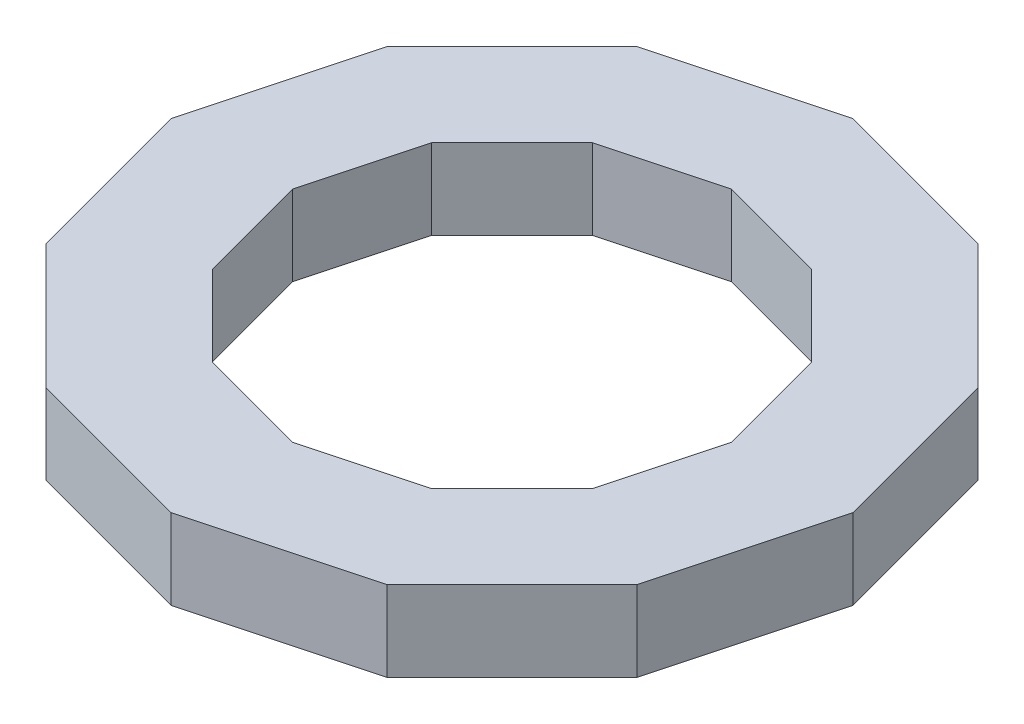
ISO-10303-21;
HEADER;
FILE_DESCRIPTION(('STEP AP214'),'2;1');
FILE_NAME('part.step','',(''),(''),'','','');
FILE_SCHEMA(('AUTOMOTIVE_DESIGN { 1 0 10303 214 1 1 1 1 }'));
ENDSEC;
DATA;
#1=APPLICATION_CONTEXT('core data for automotive mechanical design processes');
#2=APPLICATION_PROTOCOL_DEFINITION('international standard','automotive_design',2000,#1);
#3=PRODUCT_CONTEXT('',#1,'mechanical');
#4=PRODUCT('Part','Part','',(#3));
#5=PRODUCT_RELATED_PRODUCT_CATEGORY('part','',(#4));
#6=PRODUCT_DEFINITION_FORMATION('','',#4);
#7=PRODUCT_DEFINITION_CONTEXT('part definition',#1,'design');
#8=PRODUCT_DEFINITION('design','',#6,#7);
#9=PRODUCT_DEFINITION_SHAPE('','',#8);
#10=(LENGTH_UNIT() NAMED_UNIT(*) SI_UNIT(.MILLI.,.METRE.));
#11=(NAMED_UNIT(*) PLANE_ANGLE_UNIT() SI_UNIT($,.RADIAN.));
#12=(NAMED_UNIT(*) SI_UNIT($,.STERADIAN.) SOLID_ANGLE_UNIT());
#13=UNCERTAINTY_MEASURE_WITH_UNIT(LENGTH_MEASURE(1.E-05),#10,'distance_accuracy_value','');
#14=(GEOMETRIC_REPRESENTATION_CONTEXT(3) GLOBAL_UNCERTAINTY_ASSIGNED_CONTEXT((#13)) GLOBAL_UNIT_ASSIGNED_CONTEXT((#10,
#11,#12)) REPRESENTATION_CONTEXT('',''));
#15=CARTESIAN_POINT('',(0.,0.,0.));
#16=DIRECTION('',(0.,0.,1.));
#17=DIRECTION('',(1.,0.,0.));
#18=AXIS2_PLACEMENT_3D('',#15,#16,#17);
#19=CARTESIAN_POINT('',(0.,19.05,0.));
#20=DIRECTION('',(0.,1.,0.));
#21=DIRECTION('',(0.,0.,1.));
#22=AXIS2_PLACEMENT_3D('',#19,#20,#21);
#23=PLANE('',#22);
#24=DIRECTION('',(0.258819045102521,0.,-0.965925826289068));
#25=VECTOR('',#24,1.);
#26=CARTESIAN_POINT('',(70.1167965793031,19.05,40.4819513797749));
#27=LINE('',#26,#25);
#28=CARTESIAN_POINT('',(70.1167965793031,19.05,40.4819513797749));
#29=VERTEX_POINT('',#28);
#30=CARTESIAN_POINT('',(80.9639027595498,19.05,0.));
#31=VERTEX_POINT('',#30);
#32=EDGE_CURVE('E297',#29,#31,#27,.T.);
#33=ORIENTED_EDGE('',*,*,#32,.T.);
#34=DIRECTION('',(-0.258819045102521,0.,-0.965925826289068));
#35=VECTOR('',#34,1.);
#36=CARTESIAN_POINT('',(80.9639027595498,19.05,0.));
#37=LINE('',#36,#35);
#38=CARTESIAN_POINT('',(70.1167965793031,19.05,-40.4819513797749));
#39=VERTEX_POINT('',#38);
#40=EDGE_CURVE('E301',#31,#39,#37,.T.);
#41=ORIENTED_EDGE('',*,*,#40,.T.);
#42=DIRECTION('',(-0.707106781186548,0.,-0.707106781186547));
#43=VECTOR('',#42,1.);
#44=CARTESIAN_POINT('',(70.1167965793031,19.05,-40.4819513797749));
#45=LINE('',#44,#43);
#46=CARTESIAN_POINT('',(40.4819513797749,19.05,-70.1167965793031));
#47=VERTEX_POINT('',#46);
#48=EDGE_CURVE('E305',#39,#47,#45,.T.);
#49=ORIENTED_EDGE('',*,*,#48,.T.);
#50=DIRECTION('',(-0.965925826289068,0.,-0.258819045102521));
#51=VECTOR('',#50,1.);
#52=CARTESIAN_POINT('',(40.4819513797749,19.05,-70.1167965793031));
#53=LINE('',#52,#51);
#54=CARTESIAN_POINT('',(0.,19.05,-80.9639027595497));
#55=VERTEX_POINT('',#54);
#56=EDGE_CURVE('E307',#47,#55,#53,.T.);
#57=ORIENTED_EDGE('',*,*,#56,.T.);
#58=DIRECTION('',(-0.965925826289068,0.,0.258819045102521));
#59=VECTOR('',#58,1.);
#60=CARTESIAN_POINT('',(0.,19.05,-80.9639027595497));
#61=LINE('',#60,#59);
#62=CARTESIAN_POINT('',(-40.4819513797748,19.05,-70.1167965793031));
#63=VERTEX_POINT('',#62);
#64=EDGE_CURVE('E309',#55,#63,#61,.T.);
#65=ORIENTED_EDGE('',*,*,#64,.T.);
#66=DIRECTION('',(-0.707106781186547,0.,0.707106781186547));
#67=VECTOR('',#66,1.);
#68=CARTESIAN_POINT('',(-40.4819513797748,19.05,-70.1167965793031));
#69=LINE('',#68,#67);
#70=CARTESIAN_POINT('',(-70.1167965793031,19.05,-40.4819513797749));
#71=VERTEX_POINT('',#70);
#72=EDGE_CURVE('E311',#63,#71,#69,.T.);
#73=ORIENTED_EDGE('',*,*,#72,.T.);
#74=DIRECTION('',(-0.258819045102521,0.,0.965925826289068));
#75=VECTOR('',#74,1.);
#76=CARTESIAN_POINT('',(-70.1167965793031,19.05,-40.4819513797749));
#77=LINE('',#76,#75);
#78=CARTESIAN_POINT('',(-80.9639027595497,19.05,0.));
#79=VERTEX_POINT('',#78);
#80=EDGE_CURVE('E313',#71,#79,#77,.T.);
#81=ORIENTED_EDGE('',*,*,#80,.T.);
#82=DIRECTION('',(0.258819045102521,0.,0.965925826289068));
#83=VECTOR('',#82,1.);
#84=CARTESIAN_POINT('',(-80.9639027595497,19.05,0.));
#85=LINE('',#84,#83);
#86=CARTESIAN_POINT('',(-70.1167965793031,19.05,40.4819513797749));
#87=VERTEX_POINT('',#86);
#88=EDGE_CURVE('E316',#79,#87,#85,.T.);
#89=ORIENTED_EDGE('',*,*,#88,.T.);
#90=DIRECTION('',(0.707106781186548,0.,0.707106781186547));
#91=VECTOR('',#90,1.);
#92=CARTESIAN_POINT('',(-70.1167965793031,19.05,40.4819513797749));
#93=LINE('',#92,#91);
#94=CARTESIAN_POINT('',(-40.4819513797749,19.05,70.1167965793031));
#95=VERTEX_POINT('',#94);
#96=EDGE_CURVE('E318',#87,#95,#93,.T.);
#97=ORIENTED_EDGE('',*,*,#96,.T.);
#98=DIRECTION('',(0.965925826289068,0.,0.258819045102521));
#99=VECTOR('',#98,1.);
#100=CARTESIAN_POINT('',(-40.4819513797749,19.05,70.1167965793031));
#101=LINE('',#100,#99);
#102=CARTESIAN_POINT('',(0.,19.05,80.9639027595498));
#103=VERTEX_POINT('',#102);
#104=EDGE_CURVE('E320',#95,#103,#101,.T.);
#105=ORIENTED_EDGE('',*,*,#104,.T.);
#106=DIRECTION('',(0.965925826289068,0.,-0.258819045102521));
#107=VECTOR('',#106,1.);
#108=CARTESIAN_POINT('',(0.,19.05,80.9639027595498));
#109=LINE('',#108,#107);
#110=CARTESIAN_POINT('',(40.4819513797748,19.05,70.1167965793031));
#111=VERTEX_POINT('',#110);
#112=EDGE_CURVE('E322',#103,#111,#109,.T.);
#113=ORIENTED_EDGE('',*,*,#112,.T.);
#114=DIRECTION('',(0.707106781186548,0.,-0.707106781186548));
#115=VECTOR('',#114,1.);
#116=CARTESIAN_POINT('',(40.4819513797748,19.05,70.1167965793031));
#117=LINE('',#116,#115);
#118=EDGE_CURVE('E324',#111,#29,#117,.T.);
#119=ORIENTED_EDGE('',*,*,#118,.T.);
#120=EDGE_LOOP('',(#33,#41,#49,#57,#65,#73,#81,#89,#97,#105,#113,#119));
#121=FACE_BOUND('',#120,.T.);
#122=DIRECTION('',(-0.258819045102521,0.,-0.965925826289068));
#123=VECTOR('',#122,1.);
#124=CARTESIAN_POINT('',(52.038286278892,19.05,0.));
#125=LINE('',#124,#123);
#126=CARTESIAN_POINT('',(52.038286278892,19.05,0.));
#127=VERTEX_POINT('',#126);
#128=CARTESIAN_POINT('',(45.0664778869277,19.05,-26.019143139446));
#129=VERTEX_POINT('',#128);
#130=EDGE_CURVE('E205',#127,#129,#125,.T.);
#131=ORIENTED_EDGE('',*,*,#130,.F.);
#132=DIRECTION('',(0.25881904510252,0.,-0.965925826289068));
#133=VECTOR('',#132,1.);
#134=CARTESIAN_POINT('',(45.0664778869277,19.05,26.019143139446));
#135=LINE('',#134,#133);
#136=CARTESIAN_POINT('',(45.0664778869277,19.05,26.019143139446));
#137=VERTEX_POINT('',#136);
#138=EDGE_CURVE('E196',#137,#127,#135,.T.);
#139=ORIENTED_EDGE('',*,*,#138,.F.);
#140=DIRECTION('',(0.707106781186547,0.,-0.707106781186548));
#141=VECTOR('',#140,1.);
#142=CARTESIAN_POINT('',(26.019143139446,19.05,45.0664778869277));
#143=LINE('',#142,#141);
#144=CARTESIAN_POINT('',(26.019143139446,19.05,45.0664778869277));
#145=VERTEX_POINT('',#144);
#146=EDGE_CURVE('E240',#145,#137,#143,.T.);
#147=ORIENTED_EDGE('',*,*,#146,.F.);
#148=DIRECTION('',(0.965925826289068,0.,-0.258819045102521));
#149=VECTOR('',#148,1.);
#150=CARTESIAN_POINT('',(0.,19.05,52.038286278892));
#151=LINE('',#150,#149);
#152=CARTESIAN_POINT('',(0.,19.05,52.038286278892));
#153=VERTEX_POINT('',#152);
#154=EDGE_CURVE('E237',#153,#145,#151,.T.);
#155=ORIENTED_EDGE('',*,*,#154,.F.);
#156=DIRECTION('',(0.965925826289068,0.,0.258819045102521));
#157=VECTOR('',#156,1.);
#158=CARTESIAN_POINT('',(-26.019143139446,19.05,45.0664778869277));
#159=LINE('',#158,#157);
#160=CARTESIAN_POINT('',(-26.019143139446,19.05,45.0664778869277));
#161=VERTEX_POINT('',#160);
#162=EDGE_CURVE('E235',#161,#153,#159,.T.);
#163=ORIENTED_EDGE('',*,*,#162,.F.);
#164=DIRECTION('',(0.707106781186548,0.,0.707106781186547));
#165=VECTOR('',#164,1.);
#166=CARTESIAN_POINT('',(-45.0664778869277,19.05,26.019143139446));
#167=LINE('',#166,#165);
#168=CARTESIAN_POINT('',(-45.0664778869277,19.05,26.019143139446));
#169=VERTEX_POINT('',#168);
#170=EDGE_CURVE('E232',#169,#161,#167,.T.);
#171=ORIENTED_EDGE('',*,*,#170,.F.);
#172=DIRECTION('',(0.258819045102521,0.,0.965925826289068));
#173=VECTOR('',#172,1.);
#174=CARTESIAN_POINT('',(-52.0382862788921,19.05,0.));
#175=LINE('',#174,#173);
#176=CARTESIAN_POINT('',(-52.0382862788921,19.05,0.));
#177=VERTEX_POINT('',#176);
#178=EDGE_CURVE('E230',#177,#169,#175,.T.);
#179=ORIENTED_EDGE('',*,*,#178,.F.);
#180=DIRECTION('',(-0.258819045102521,0.,0.965925826289068));
#181=VECTOR('',#180,1.);
#182=CARTESIAN_POINT('',(-45.0664778869277,19.05,-26.019143139446));
#183=LINE('',#182,#181);
#184=CARTESIAN_POINT('',(-45.0664778869277,19.05,-26.019143139446));
#185=VERTEX_POINT('',#184);
#186=EDGE_CURVE('E228',#185,#177,#183,.T.);
#187=ORIENTED_EDGE('',*,*,#186,.F.);
#188=DIRECTION('',(-0.707106781186547,0.,0.707106781186548));
#189=VECTOR('',#188,1.);
#190=CARTESIAN_POINT('',(-26.019143139446,19.05,-45.0664778869277));
#191=LINE('',#190,#189);
#192=CARTESIAN_POINT('',(-26.019143139446,19.05,-45.0664778869277));
#193=VERTEX_POINT('',#192);
#194=EDGE_CURVE('E226',#193,#185,#191,.T.);
#195=ORIENTED_EDGE('',*,*,#194,.F.);
#196=DIRECTION('',(-0.965925826289068,0.,0.258819045102521));
#197=VECTOR('',#196,1.);
#198=CARTESIAN_POINT('',(0.,19.05,-52.038286278892));
#199=LINE('',#198,#197);
#200=CARTESIAN_POINT('',(0.,19.05,-52.038286278892));
#201=VERTEX_POINT('',#200);
#202=EDGE_CURVE('E224',#201,#193,#199,.T.);
#203=ORIENTED_EDGE('',*,*,#202,.F.);
#204=DIRECTION('',(-0.965925826289068,0.,-0.25881904510252));
#205=VECTOR('',#204,1.);
#206=CARTESIAN_POINT('',(26.0191431394459,19.05,-45.0664778869277));
#207=LINE('',#206,#205);
#208=CARTESIAN_POINT('',(26.0191431394459,19.05,-45.0664778869277));
#209=VERTEX_POINT('',#208);
#210=EDGE_CURVE('E220',#209,#201,#207,.T.);
#211=ORIENTED_EDGE('',*,*,#210,.F.);
#212=DIRECTION('',(-0.707106781186548,0.,-0.707106781186547));
#213=VECTOR('',#212,1.);
#214=CARTESIAN_POINT('',(45.0664778869277,19.05,-26.019143139446));
#215=LINE('',#214,#213);
#216=EDGE_CURVE('E218',#129,#209,#215,.T.);
#217=ORIENTED_EDGE('',*,*,#216,.F.);
#218=EDGE_LOOP('',(#131,#139,#147,#155,#163,#171,#179,#187,#195,#203,#211,#217));
#219=FACE_BOUND('',#218,.T.);
#220=ADVANCED_FACE('F35',(#121,#219),#23,.T.);
#221=CARTESIAN_POINT('',(0.,0.,0.));
#222=DIRECTION('',(0.,1.,0.));
#223=DIRECTION('',(0.,0.,1.));
#224=AXIS2_PLACEMENT_3D('',#221,#222,#223);
#225=PLANE('',#224);
#226=DIRECTION('',(0.258819045102521,0.,-0.965925826289068));
#227=VECTOR('',#226,1.);
#228=CARTESIAN_POINT('',(70.1167965793031,0.,40.4819513797749));
#229=LINE('',#228,#227);
#230=CARTESIAN_POINT('',(70.1167965793031,0.,40.4819513797749));
#231=VERTEX_POINT('',#230);
#232=CARTESIAN_POINT('',(80.9639027595498,0.,0.));
#233=VERTEX_POINT('',#232);
#234=EDGE_CURVE('E213',#231,#233,#229,.T.);
#235=ORIENTED_EDGE('',*,*,#234,.F.);
#236=DIRECTION('',(0.707106781186548,0.,-0.707106781186548));
#237=VECTOR('',#236,1.);
#238=CARTESIAN_POINT('',(40.4819513797748,0.,70.1167965793031));
#239=LINE('',#238,#237);
#240=CARTESIAN_POINT('',(40.4819513797748,0.,70.1167965793031));
#241=VERTEX_POINT('',#240);
#242=EDGE_CURVE('E302',#241,#231,#239,.T.);
#243=ORIENTED_EDGE('',*,*,#242,.F.);
#244=DIRECTION('',(0.965925826289068,0.,-0.258819045102521));
#245=VECTOR('',#244,1.);
#246=CARTESIAN_POINT('',(0.,0.,80.9639027595498));
#247=LINE('',#246,#245);
#248=CARTESIAN_POINT('',(0.,0.,80.9639027595498));
#249=VERTEX_POINT('',#248);
#250=EDGE_CURVE('E348',#249,#241,#247,.T.);
#251=ORIENTED_EDGE('',*,*,#250,.F.);
#252=DIRECTION('',(0.965925826289068,0.,0.258819045102521));
#253=VECTOR('',#252,1.);
#254=CARTESIAN_POINT('',(-40.4819513797749,0.,70.1167965793031));
#255=LINE('',#254,#253);
#256=CARTESIAN_POINT('',(-40.4819513797749,0.,70.1167965793031));
#257=VERTEX_POINT('',#256);
#258=EDGE_CURVE('E346',#257,#249,#255,.T.);
#259=ORIENTED_EDGE('',*,*,#258,.F.);
#260=DIRECTION('',(0.707106781186548,0.,0.707106781186547));
#261=VECTOR('',#260,1.);
#262=CARTESIAN_POINT('',(-70.1167965793031,0.,40.4819513797749));
#263=LINE('',#262,#261);
#264=CARTESIAN_POINT('',(-70.1167965793031,0.,40.4819513797749));
#265=VERTEX_POINT('',#264);
#266=EDGE_CURVE('E344',#265,#257,#263,.T.);
#267=ORIENTED_EDGE('',*,*,#266,.F.);
#268=DIRECTION('',(0.258819045102521,0.,0.965925826289068));
#269=VECTOR('',#268,1.);
#270=CARTESIAN_POINT('',(-80.9639027595497,0.,0.));
#271=LINE('',#270,#269);
#272=CARTESIAN_POINT('',(-80.9639027595497,0.,0.));
#273=VERTEX_POINT('',#272);
#274=EDGE_CURVE('E342',#273,#265,#271,.T.);
#275=ORIENTED_EDGE('',*,*,#274,.F.);
#276=DIRECTION('',(-0.258819045102521,0.,0.965925826289068));
#277=VECTOR('',#276,1.);
#278=CARTESIAN_POINT('',(-70.1167965793031,0.,-40.4819513797749));
#279=LINE('',#278,#277);
#280=CARTESIAN_POINT('',(-70.1167965793031,0.,-40.4819513797749));
#281=VERTEX_POINT('',#280);
#282=EDGE_CURVE('E340',#281,#273,#279,.T.);
#283=ORIENTED_EDGE('',*,*,#282,.F.);
#284=DIRECTION('',(-0.707106781186547,0.,0.707106781186547));
#285=VECTOR('',#284,1.);
#286=CARTESIAN_POINT('',(-40.4819513797748,0.,-70.1167965793031));
#287=LINE('',#286,#285);
#288=CARTESIAN_POINT('',(-40.4819513797748,0.,-70.1167965793031));
#289=VERTEX_POINT('',#288);
#290=EDGE_CURVE('E338',#289,#281,#287,.T.);
#291=ORIENTED_EDGE('',*,*,#290,.F.);
#292=DIRECTION('',(-0.965925826289068,0.,0.258819045102521));
#293=VECTOR('',#292,1.);
#294=CARTESIAN_POINT('',(0.,0.,-80.9639027595497));
#295=LINE('',#294,#293);
#296=CARTESIAN_POINT('',(0.,0.,-80.9639027595497));
#297=VERTEX_POINT('',#296);
#298=EDGE_CURVE('E336',#297,#289,#295,.T.);
#299=ORIENTED_EDGE('',*,*,#298,.F.);
#300=DIRECTION('',(-0.965925826289068,0.,-0.258819045102521));
#301=VECTOR('',#300,1.);
#302=CARTESIAN_POINT('',(40.4819513797749,0.,-70.1167965793031));
#303=LINE('',#302,#301);
#304=CARTESIAN_POINT('',(40.4819513797749,0.,-70.1167965793031));
#305=VERTEX_POINT('',#304);
#306=EDGE_CURVE('E334',#305,#297,#303,.T.);
#307=ORIENTED_EDGE('',*,*,#306,.F.);
#308=DIRECTION('',(-0.707106781186548,0.,-0.707106781186547));
#309=VECTOR('',#308,1.);
#310=CARTESIAN_POINT('',(70.1167965793031,0.,-40.4819513797749));
#311=LINE('',#310,#309);
#312=CARTESIAN_POINT('',(70.1167965793031,0.,-40.4819513797749));
#313=VERTEX_POINT('',#312);
#314=EDGE_CURVE('E332',#313,#305,#311,.T.);
#315=ORIENTED_EDGE('',*,*,#314,.F.);
#316=DIRECTION('',(-0.258819045102521,0.,-0.965925826289068));
#317=VECTOR('',#316,1.);
#318=CARTESIAN_POINT('',(80.9639027595498,0.,0.));
#319=LINE('',#318,#317);
#320=EDGE_CURVE('E329',#233,#313,#319,.T.);
#321=ORIENTED_EDGE('',*,*,#320,.F.);
#322=EDGE_LOOP('',(#235,#243,#251,#259,#267,#275,#283,#291,#299,#307,#315,#321));
#323=FACE_BOUND('',#322,.T.);
#324=DIRECTION('',(0.25881904510252,0.,-0.965925826289068));
#325=VECTOR('',#324,1.);
#326=CARTESIAN_POINT('',(45.0664778869277,0.,26.019143139446));
#327=LINE('',#326,#325);
#328=CARTESIAN_POINT('',(45.0664778869277,0.,26.019143139446));
#329=VERTEX_POINT('',#328);
#330=CARTESIAN_POINT('',(52.038286278892,0.,0.));
#331=VERTEX_POINT('',#330);
#332=EDGE_CURVE('E58',#329,#331,#327,.T.);
#333=ORIENTED_EDGE('',*,*,#332,.T.);
#334=DIRECTION('',(-0.258819045102521,0.,-0.965925826289068));
#335=VECTOR('',#334,1.);
#336=CARTESIAN_POINT('',(52.038286278892,0.,0.));
#337=LINE('',#336,#335);
#338=CARTESIAN_POINT('',(45.0664778869277,0.,-26.019143139446));
#339=VERTEX_POINT('',#338);
#340=EDGE_CURVE('E212',#331,#339,#337,.T.);
#341=ORIENTED_EDGE('',*,*,#340,.T.);
#342=DIRECTION('',(-0.707106781186548,0.,-0.707106781186547));
#343=VECTOR('',#342,1.);
#344=CARTESIAN_POINT('',(45.0664778869277,0.,-26.019143139446));
#345=LINE('',#344,#343);
#346=CARTESIAN_POINT('',(26.0191431394459,0.,-45.0664778869277));
#347=VERTEX_POINT('',#346);
#348=EDGE_CURVE('E245',#339,#347,#345,.T.);
#349=ORIENTED_EDGE('',*,*,#348,.T.);
#350=DIRECTION('',(-0.965925826289068,0.,-0.25881904510252));
#351=VECTOR('',#350,1.);
#352=CARTESIAN_POINT('',(26.0191431394459,0.,-45.0664778869277));
#353=LINE('',#352,#351);
#354=CARTESIAN_POINT('',(0.,0.,-52.038286278892));
#355=VERTEX_POINT('',#354);
#356=EDGE_CURVE('E248',#347,#355,#353,.T.);
#357=ORIENTED_EDGE('',*,*,#356,.T.);
#358=DIRECTION('',(-0.965925826289068,0.,0.258819045102521));
#359=VECTOR('',#358,1.);
#360=CARTESIAN_POINT('',(0.,0.,-52.038286278892));
#361=LINE('',#360,#359);
#362=CARTESIAN_POINT('',(-26.019143139446,0.,-45.0664778869277));
#363=VERTEX_POINT('',#362);
#364=EDGE_CURVE('E251',#355,#363,#361,.T.);
#365=ORIENTED_EDGE('',*,*,#364,.T.);
#366=DIRECTION('',(-0.707106781186547,0.,0.707106781186548));
#367=VECTOR('',#366,1.);
#368=CARTESIAN_POINT('',(-26.019143139446,0.,-45.0664778869277));
#369=LINE('',#368,#367);
#370=CARTESIAN_POINT('',(-45.0664778869277,0.,-26.019143139446));
#371=VERTEX_POINT('',#370);
#372=EDGE_CURVE('E254',#363,#371,#369,.T.);
#373=ORIENTED_EDGE('',*,*,#372,.T.);
#374=DIRECTION('',(-0.258819045102521,0.,0.965925826289068));
#375=VECTOR('',#374,1.);
#376=CARTESIAN_POINT('',(-45.0664778869277,0.,-26.019143139446));
#377=LINE('',#376,#375);
#378=CARTESIAN_POINT('',(-52.0382862788921,0.,0.));
#379=VERTEX_POINT('',#378);
#380=EDGE_CURVE('E257',#371,#379,#377,.T.);
#381=ORIENTED_EDGE('',*,*,#380,.T.);
#382=DIRECTION('',(0.258819045102521,0.,0.965925826289068));
#383=VECTOR('',#382,1.);
#384=CARTESIAN_POINT('',(-52.0382862788921,0.,0.));
#385=LINE('',#384,#383);
#386=CARTESIAN_POINT('',(-45.0664778869277,0.,26.019143139446));
#387=VERTEX_POINT('',#386);
#388=EDGE_CURVE('E261',#379,#387,#385,.T.);
#389=ORIENTED_EDGE('',*,*,#388,.T.);
#390=DIRECTION('',(0.707106781186548,0.,0.707106781186547));
#391=VECTOR('',#390,1.);
#392=CARTESIAN_POINT('',(-45.0664778869277,0.,26.019143139446));
#393=LINE('',#392,#391);
#394=CARTESIAN_POINT('',(-26.019143139446,0.,45.0664778869277));
#395=VERTEX_POINT('',#394);
#396=EDGE_CURVE('E264',#387,#395,#393,.T.);
#397=ORIENTED_EDGE('',*,*,#396,.T.);
#398=DIRECTION('',(0.965925826289068,0.,0.258819045102521));
#399=VECTOR('',#398,1.);
#400=CARTESIAN_POINT('',(-26.019143139446,0.,45.0664778869277));
#401=LINE('',#400,#399);
#402=CARTESIAN_POINT('',(0.,0.,52.038286278892));
#403=VERTEX_POINT('',#402);
#404=EDGE_CURVE('E267',#395,#403,#401,.T.);
#405=ORIENTED_EDGE('',*,*,#404,.T.);
#406=DIRECTION('',(0.965925826289068,0.,-0.258819045102521));
#407=VECTOR('',#406,1.);
#408=CARTESIAN_POINT('',(0.,0.,52.038286278892));
#409=LINE('',#408,#407);
#410=CARTESIAN_POINT('',(26.019143139446,0.,45.0664778869277));
#411=VERTEX_POINT('',#410);
#412=EDGE_CURVE('E270',#403,#411,#409,.T.);
#413=ORIENTED_EDGE('',*,*,#412,.T.);
#414=DIRECTION('',(0.707106781186547,0.,-0.707106781186548));
#415=VECTOR('',#414,1.);
#416=CARTESIAN_POINT('',(26.019143139446,0.,45.0664778869277));
#417=LINE('',#416,#415);
#418=EDGE_CURVE('E206',#411,#329,#417,.T.);
#419=ORIENTED_EDGE('',*,*,#418,.T.);
#420=EDGE_LOOP('',(#333,#341,#349,#357,#365,#373,#381,#389,#397,#405,#413,#419));
#421=FACE_BOUND('',#420,.T.);
#422=ADVANCED_FACE('F390',(#323,#421),#225,.F.);
#423=CARTESIAN_POINT('',(70.1167965793031,19.05,40.4819513797749));
#424=DIRECTION('',(-0.965925826289068,0.,-0.258819045102522));
#425=DIRECTION('',(-0.258819045102521,0.,0.965925826289068));
#426=AXIS2_PLACEMENT_3D('',#423,#424,#425);
#427=PLANE('',#426);
#428=ORIENTED_EDGE('',*,*,#234,.T.);
#429=DIRECTION('',(0.,-1.,0.));
#430=VECTOR('',#429,1.);
#431=CARTESIAN_POINT('',(80.9639027595498,19.05,0.));
#432=LINE('',#431,#430);
#433=EDGE_CURVE('E11',#31,#233,#432,.T.);
#434=ORIENTED_EDGE('',*,*,#433,.F.);
#435=ORIENTED_EDGE('',*,*,#32,.F.);
#436=DIRECTION('',(0.,-1.,0.));
#437=VECTOR('',#436,1.);
#438=CARTESIAN_POINT('',(70.1167965793031,19.05,40.4819513797749));
#439=LINE('',#438,#437);
#440=EDGE_CURVE('E326',#29,#231,#439,.T.);
#441=ORIENTED_EDGE('',*,*,#440,.T.);
#442=EDGE_LOOP('',(#428,#434,#435,#441));
#443=FACE_BOUND('',#442,.T.);
#444=ADVANCED_FACE('F37',(#443),#427,.F.);
#445=CARTESIAN_POINT('',(80.9639027595498,19.05,0.));
#446=DIRECTION('',(-0.965925826289068,0.,0.258819045102521));
#447=DIRECTION('',(0.258819045102521,0.,0.965925826289068));
#448=AXIS2_PLACEMENT_3D('',#445,#446,#447);
#449=PLANE('',#448);
#450=ORIENTED_EDGE('',*,*,#320,.T.);
#451=DIRECTION('',(0.,-1.,0.));
#452=VECTOR('',#451,1.);
#453=CARTESIAN_POINT('',(70.1167965793031,19.05,-40.4819513797749));
#454=LINE('',#453,#452);
#455=EDGE_CURVE('E43',#39,#313,#454,.T.);
#456=ORIENTED_EDGE('',*,*,#455,.F.);
#457=ORIENTED_EDGE('',*,*,#40,.F.);
#458=ORIENTED_EDGE('',*,*,#433,.T.);
#459=EDGE_LOOP('',(#450,#456,#457,#458));
#460=FACE_BOUND('',#459,.T.);
#461=ADVANCED_FACE('F407',(#460),#449,.F.);
#462=CARTESIAN_POINT('',(70.1167965793031,19.05,-40.4819513797749));
#463=DIRECTION('',(-0.707106781186547,0.,0.707106781186548));
#464=DIRECTION('',(0.707106781186548,0.,0.707106781186547));
#465=AXIS2_PLACEMENT_3D('',#462,#463,#464);
#466=PLANE('',#465);
#467=ORIENTED_EDGE('',*,*,#314,.T.);
#468=DIRECTION('',(0.,-1.,0.));
#469=VECTOR('',#468,1.);
#470=CARTESIAN_POINT('',(40.4819513797749,19.05,-70.1167965793031));
#471=LINE('',#470,#469);
#472=EDGE_CURVE('E377',#47,#305,#471,.T.);
#473=ORIENTED_EDGE('',*,*,#472,.F.);
#474=ORIENTED_EDGE('',*,*,#48,.F.);
#475=ORIENTED_EDGE('',*,*,#455,.T.);
#476=EDGE_LOOP('',(#467,#473,#474,#475));
#477=FACE_BOUND('',#476,.T.);
#478=ADVANCED_FACE('F384',(#477),#466,.F.);
#479=CARTESIAN_POINT('',(40.4819513797749,19.05,-70.1167965793031));
#480=DIRECTION('',(-0.258819045102521,0.,0.965925826289068));
#481=DIRECTION('',(0.965925826289068,0.,0.258819045102521));
#482=AXIS2_PLACEMENT_3D('',#479,#480,#481);
#483=PLANE('',#482);
#484=ORIENTED_EDGE('',*,*,#306,.T.);
#485=DIRECTION('',(0.,-1.,0.));
#486=VECTOR('',#485,1.);
#487=CARTESIAN_POINT('',(0.,19.05,-80.9639027595497));
#488=LINE('',#487,#486);
#489=EDGE_CURVE('E374',#55,#297,#488,.T.);
#490=ORIENTED_EDGE('',*,*,#489,.F.);
#491=ORIENTED_EDGE('',*,*,#56,.F.);
#492=ORIENTED_EDGE('',*,*,#472,.T.);
#493=EDGE_LOOP('',(#484,#490,#491,#492));
#494=FACE_BOUND('',#493,.T.);
#495=ADVANCED_FACE('F396',(#494),#483,.F.);
#496=CARTESIAN_POINT('',(0.,19.05,-80.9639027595497));
#497=DIRECTION('',(0.258819045102521,0.,0.965925826289068));
#498=DIRECTION('',(0.965925826289068,0.,-0.258819045102521));
#499=AXIS2_PLACEMENT_3D('',#496,#497,#498);
#500=PLANE('',#499);
#501=ORIENTED_EDGE('',*,*,#298,.T.);
#502=DIRECTION('',(0.,-1.,0.));
#503=VECTOR('',#502,1.);
#504=CARTESIAN_POINT('',(-40.4819513797748,19.05,-70.1167965793031));
#505=LINE('',#504,#503);
#506=EDGE_CURVE('E371',#63,#289,#505,.T.);
#507=ORIENTED_EDGE('',*,*,#506,.F.);
#508=ORIENTED_EDGE('',*,*,#64,.F.);
#509=ORIENTED_EDGE('',*,*,#489,.T.);
#510=EDGE_LOOP('',(#501,#507,#508,#509));
#511=FACE_BOUND('',#510,.T.);
#512=ADVANCED_FACE('F400',(#511),#500,.F.);
#513=CARTESIAN_POINT('',(-40.4819513797748,19.05,-70.1167965793031));
#514=DIRECTION('',(0.707106781186547,0.,0.707106781186547));
#515=DIRECTION('',(0.707106781186548,0.,-0.707106781186548));
#516=AXIS2_PLACEMENT_3D('',#513,#514,#515);
#517=PLANE('',#516);
#518=ORIENTED_EDGE('',*,*,#290,.T.);
#519=DIRECTION('',(0.,-1.,0.));
#520=VECTOR('',#519,1.);
#521=CARTESIAN_POINT('',(-70.1167965793031,19.05,-40.4819513797749));
#522=LINE('',#521,#520);
#523=EDGE_CURVE('E368',#71,#281,#522,.T.);
#524=ORIENTED_EDGE('',*,*,#523,.F.);
#525=ORIENTED_EDGE('',*,*,#72,.F.);
#526=ORIENTED_EDGE('',*,*,#506,.T.);
#527=EDGE_LOOP('',(#518,#524,#525,#526));
#528=FACE_BOUND('',#527,.T.);
#529=ADVANCED_FACE('F440',(#528),#517,.F.);
#530=CARTESIAN_POINT('',(-70.1167965793031,19.05,-40.4819513797749));
#531=DIRECTION('',(0.965925826289068,0.,0.258819045102521));
#532=DIRECTION('',(0.258819045102521,0.,-0.965925826289068));
#533=AXIS2_PLACEMENT_3D('',#530,#531,#532);
#534=PLANE('',#533);
#535=ORIENTED_EDGE('',*,*,#282,.T.);
#536=DIRECTION('',(0.,-1.,0.));
#537=VECTOR('',#536,1.);
#538=CARTESIAN_POINT('',(-80.9639027595497,19.05,0.));
#539=LINE('',#538,#537);
#540=EDGE_CURVE('E365',#79,#273,#539,.T.);
#541=ORIENTED_EDGE('',*,*,#540,.F.);
#542=ORIENTED_EDGE('',*,*,#80,.F.);
#543=ORIENTED_EDGE('',*,*,#523,.T.);
#544=EDGE_LOOP('',(#535,#541,#542,#543));
#545=FACE_BOUND('',#544,.T.);
#546=ADVANCED_FACE('F438',(#545),#534,.F.);
#547=CARTESIAN_POINT('',(-80.9639027595497,19.05,0.));
#548=DIRECTION('',(0.965925826289068,0.,-0.258819045102521));
#549=DIRECTION('',(-0.258819045102521,0.,-0.965925826289068));
#550=AXIS2_PLACEMENT_3D('',#547,#548,#549);
#551=PLANE('',#550);
#552=ORIENTED_EDGE('',*,*,#274,.T.);
#553=DIRECTION('',(0.,-1.,0.));
#554=VECTOR('',#553,1.);
#555=CARTESIAN_POINT('',(-70.1167965793031,19.05,40.4819513797749));
#556=LINE('',#555,#554);
#557=EDGE_CURVE('E362',#87,#265,#556,.T.);
#558=ORIENTED_EDGE('',*,*,#557,.F.);
#559=ORIENTED_EDGE('',*,*,#88,.F.);
#560=ORIENTED_EDGE('',*,*,#540,.T.);
#561=EDGE_LOOP('',(#552,#558,#559,#560));
#562=FACE_BOUND('',#561,.T.);
#563=ADVANCED_FACE('F434',(#562),#551,.F.);
#564=CARTESIAN_POINT('',(-70.1167965793031,19.05,40.4819513797749));
#565=DIRECTION('',(0.707106781186547,0.,-0.707106781186548));
#566=DIRECTION('',(-0.707106781186548,0.,-0.707106781186547));
#567=AXIS2_PLACEMENT_3D('',#564,#565,#566);
#568=PLANE('',#567);
#569=ORIENTED_EDGE('',*,*,#266,.T.);
#570=DIRECTION('',(0.,-1.,0.));
#571=VECTOR('',#570,1.);
#572=CARTESIAN_POINT('',(-40.4819513797749,19.05,70.1167965793031));
#573=LINE('',#572,#571);
#574=EDGE_CURVE('E359',#95,#257,#573,.T.);
#575=ORIENTED_EDGE('',*,*,#574,.F.);
#576=ORIENTED_EDGE('',*,*,#96,.F.);
#577=ORIENTED_EDGE('',*,*,#557,.T.);
#578=EDGE_LOOP('',(#569,#575,#576,#577));
#579=FACE_BOUND('',#578,.T.);
#580=ADVANCED_FACE('F429',(#579),#568,.F.);
#581=CARTESIAN_POINT('',(-40.4819513797749,19.05,70.1167965793031));
#582=DIRECTION('',(0.258819045102521,0.,-0.965925826289068));
#583=DIRECTION('',(-0.965925826289068,0.,-0.258819045102521));
#584=AXIS2_PLACEMENT_3D('',#581,#582,#583);
#585=PLANE('',#584);
#586=ORIENTED_EDGE('',*,*,#258,.T.);
#587=DIRECTION('',(0.,-1.,0.));
#588=VECTOR('',#587,1.);
#589=CARTESIAN_POINT('',(0.,19.05,80.9639027595498));
#590=LINE('',#589,#588);
#591=EDGE_CURVE('E356',#103,#249,#590,.T.);
#592=ORIENTED_EDGE('',*,*,#591,.F.);
#593=ORIENTED_EDGE('',*,*,#104,.F.);
#594=ORIENTED_EDGE('',*,*,#574,.T.);
#595=EDGE_LOOP('',(#586,#592,#593,#594));
#596=FACE_BOUND('',#595,.T.);
#597=ADVANCED_FACE('F423',(#596),#585,.F.);
#598=CARTESIAN_POINT('',(0.,19.05,80.9639027595498));
#599=DIRECTION('',(-0.258819045102521,0.,-0.965925826289068));
#600=DIRECTION('',(-0.965925826289068,0.,0.258819045102521));
#601=AXIS2_PLACEMENT_3D('',#598,#599,#600);
#602=PLANE('',#601);
#603=ORIENTED_EDGE('',*,*,#250,.T.);
#604=DIRECTION('',(0.,-1.,0.));
#605=VECTOR('',#604,1.);
#606=CARTESIAN_POINT('',(40.4819513797748,19.05,70.1167965793031));
#607=LINE('',#606,#605);
#608=EDGE_CURVE('E353',#111,#241,#607,.T.);
#609=ORIENTED_EDGE('',*,*,#608,.F.);
#610=ORIENTED_EDGE('',*,*,#112,.F.);
#611=ORIENTED_EDGE('',*,*,#591,.T.);
#612=EDGE_LOOP('',(#603,#609,#610,#611));
#613=FACE_BOUND('',#612,.T.);
#614=ADVANCED_FACE('F419',(#613),#602,.F.);
#615=CARTESIAN_POINT('',(40.4819513797748,19.05,70.1167965793031));
#616=DIRECTION('',(-0.707106781186548,0.,-0.707106781186548));
#617=DIRECTION('',(-0.707106781186548,0.,0.707106781186548));
#618=AXIS2_PLACEMENT_3D('',#615,#616,#617);
#619=PLANE('',#618);
#620=ORIENTED_EDGE('',*,*,#242,.T.);
#621=ORIENTED_EDGE('',*,*,#440,.F.);
#622=ORIENTED_EDGE('',*,*,#118,.F.);
#623=ORIENTED_EDGE('',*,*,#608,.T.);
#624=EDGE_LOOP('',(#620,#621,#622,#623));
#625=FACE_BOUND('',#624,.T.);
#626=ADVANCED_FACE('F414',(#625),#619,.F.);
#627=CARTESIAN_POINT('',(45.0664778869277,19.05,26.019143139446));
#628=DIRECTION('',(-0.965925826289068,0.,-0.25881904510252));
#629=DIRECTION('',(-0.25881904510252,0.,0.965925826289069));
#630=AXIS2_PLACEMENT_3D('',#627,#628,#629);
#631=PLANE('',#630);
#632=ORIENTED_EDGE('',*,*,#332,.F.);
#633=DIRECTION('',(0.,-1.,0.));
#634=VECTOR('',#633,1.);
#635=CARTESIAN_POINT('',(45.0664778869277,19.05,26.019143139446));
#636=LINE('',#635,#634);
#637=EDGE_CURVE('E200',#137,#329,#636,.T.);
#638=ORIENTED_EDGE('',*,*,#637,.F.);
#639=ORIENTED_EDGE('',*,*,#138,.T.);
#640=DIRECTION('',(0.,-1.,0.));
#641=VECTOR('',#640,1.);
#642=CARTESIAN_POINT('',(52.038286278892,19.05,0.));
#643=LINE('',#642,#641);
#644=EDGE_CURVE('E199',#127,#331,#643,.T.);
#645=ORIENTED_EDGE('',*,*,#644,.T.);
#646=EDGE_LOOP('',(#632,#638,#639,#645));
#647=FACE_BOUND('',#646,.T.);
#648=ADVANCED_FACE('F198',(#647),#631,.T.);
#649=CARTESIAN_POINT('',(52.038286278892,19.05,0.));
#650=DIRECTION('',(-0.965925826289068,0.,0.258819045102521));
#651=DIRECTION('',(0.258819045102521,0.,0.965925826289068));
#652=AXIS2_PLACEMENT_3D('',#649,#650,#651);
#653=PLANE('',#652);
#654=ORIENTED_EDGE('',*,*,#340,.F.);
#655=ORIENTED_EDGE('',*,*,#644,.F.);
#656=ORIENTED_EDGE('',*,*,#130,.T.);
#657=DIRECTION('',(0.,-1.,0.));
#658=VECTOR('',#657,1.);
#659=CARTESIAN_POINT('',(45.0664778869277,19.05,-26.019143139446));
#660=LINE('',#659,#658);
#661=EDGE_CURVE('E214',#129,#339,#660,.T.);
#662=ORIENTED_EDGE('',*,*,#661,.T.);
#663=EDGE_LOOP('',(#654,#655,#656,#662));
#664=FACE_BOUND('',#663,.T.);
#665=ADVANCED_FACE('F209',(#664),#653,.T.);
#666=CARTESIAN_POINT('',(45.0664778869277,19.05,-26.019143139446));
#667=DIRECTION('',(-0.707106781186547,0.,0.707106781186548));
#668=DIRECTION('',(0.707106781186548,0.,0.707106781186547));
#669=AXIS2_PLACEMENT_3D('',#666,#667,#668);
#670=PLANE('',#669);
#671=ORIENTED_EDGE('',*,*,#348,.F.);
#672=ORIENTED_EDGE('',*,*,#661,.F.);
#673=ORIENTED_EDGE('',*,*,#216,.T.);
#674=DIRECTION('',(0.,-1.,0.));
#675=VECTOR('',#674,1.);
#676=CARTESIAN_POINT('',(26.0191431394459,19.05,-45.0664778869277));
#677=LINE('',#676,#675);
#678=EDGE_CURVE('E294',#209,#347,#677,.T.);
#679=ORIENTED_EDGE('',*,*,#678,.T.);
#680=EDGE_LOOP('',(#671,#672,#673,#679));
#681=FACE_BOUND('',#680,.T.);
#682=ADVANCED_FACE('F498',(#681),#670,.T.);
#683=CARTESIAN_POINT('',(26.0191431394459,19.05,-45.0664778869277));
#684=DIRECTION('',(-0.25881904510252,0.,0.965925826289068));
#685=DIRECTION('',(0.965925826289069,0.,0.25881904510252));
#686=AXIS2_PLACEMENT_3D('',#683,#684,#685);
#687=PLANE('',#686);
#688=ORIENTED_EDGE('',*,*,#356,.F.);
#689=ORIENTED_EDGE('',*,*,#678,.F.);
#690=ORIENTED_EDGE('',*,*,#210,.T.);
#691=DIRECTION('',(0.,-1.,0.));
#692=VECTOR('',#691,1.);
#693=CARTESIAN_POINT('',(0.,19.05,-52.038286278892));
#694=LINE('',#693,#692);
#695=EDGE_CURVE('E291',#201,#355,#694,.T.);
#696=ORIENTED_EDGE('',*,*,#695,.T.);
#697=EDGE_LOOP('',(#688,#689,#690,#696));
#698=FACE_BOUND('',#697,.T.);
#699=ADVANCED_FACE('F504',(#698),#687,.T.);
#700=CARTESIAN_POINT('',(0.,19.05,-52.038286278892));
#701=DIRECTION('',(0.258819045102521,0.,0.965925826289068));
#702=DIRECTION('',(0.965925826289068,0.,-0.258819045102521));
#703=AXIS2_PLACEMENT_3D('',#700,#701,#702);
#704=PLANE('',#703);
#705=ORIENTED_EDGE('',*,*,#364,.F.);
#706=ORIENTED_EDGE('',*,*,#695,.F.);
#707=ORIENTED_EDGE('',*,*,#202,.T.);
#708=DIRECTION('',(0.,-1.,0.));
#709=VECTOR('',#708,1.);
#710=CARTESIAN_POINT('',(-26.019143139446,19.05,-45.0664778869277));
#711=LINE('',#710,#709);
#712=EDGE_CURVE('E289',#193,#363,#711,.T.);
#713=ORIENTED_EDGE('',*,*,#712,.T.);
#714=EDGE_LOOP('',(#705,#706,#707,#713));
#715=FACE_BOUND('',#714,.T.);
#716=ADVANCED_FACE('F512',(#715),#704,.T.);
#717=CARTESIAN_POINT('',(-26.019143139446,19.05,-45.0664778869277));
#718=DIRECTION('',(0.707106781186548,0.,0.707106781186547));
#719=DIRECTION('',(0.707106781186547,0.,-0.707106781186548));
#720=AXIS2_PLACEMENT_3D('',#717,#718,#719);
#721=PLANE('',#720);
#722=ORIENTED_EDGE('',*,*,#372,.F.);
#723=ORIENTED_EDGE('',*,*,#712,.F.);
#724=ORIENTED_EDGE('',*,*,#194,.T.);
#725=DIRECTION('',(0.,-1.,0.));
#726=VECTOR('',#725,1.);
#727=CARTESIAN_POINT('',(-45.0664778869277,19.05,-26.019143139446));
#728=LINE('',#727,#726);
#729=EDGE_CURVE('E287',#185,#371,#728,.T.);
#730=ORIENTED_EDGE('',*,*,#729,.T.);
#731=EDGE_LOOP('',(#722,#723,#724,#730));
#732=FACE_BOUND('',#731,.T.);
#733=ADVANCED_FACE('F520',(#732),#721,.T.);
#734=CARTESIAN_POINT('',(-45.0664778869277,19.05,-26.019143139446));
#735=DIRECTION('',(0.965925826289068,0.,0.258819045102521));
#736=DIRECTION('',(0.258819045102521,0.,-0.965925826289068));
#737=AXIS2_PLACEMENT_3D('',#734,#735,#736);
#738=PLANE('',#737);
#739=ORIENTED_EDGE('',*,*,#380,.F.);
#740=ORIENTED_EDGE('',*,*,#729,.F.);
#741=ORIENTED_EDGE('',*,*,#186,.T.);
#742=DIRECTION('',(0.,-1.,0.));
#743=VECTOR('',#742,1.);
#744=CARTESIAN_POINT('',(-52.0382862788921,19.05,0.));
#745=LINE('',#744,#743);
#746=EDGE_CURVE('E284',#177,#379,#745,.T.);
#747=ORIENTED_EDGE('',*,*,#746,.T.);
#748=EDGE_LOOP('',(#739,#740,#741,#747));
#749=FACE_BOUND('',#748,.T.);
#750=ADVANCED_FACE('F528',(#749),#738,.T.);
#751=CARTESIAN_POINT('',(-52.0382862788921,19.05,0.));
#752=DIRECTION('',(0.965925826289068,0.,-0.258819045102521));
#753=DIRECTION('',(-0.258819045102521,0.,-0.965925826289068));
#754=AXIS2_PLACEMENT_3D('',#751,#752,#753);
#755=PLANE('',#754);
#756=ORIENTED_EDGE('',*,*,#388,.F.);
#757=ORIENTED_EDGE('',*,*,#746,.F.);
#758=ORIENTED_EDGE('',*,*,#178,.T.);
#759=DIRECTION('',(0.,-1.,0.));
#760=VECTOR('',#759,1.);
#761=CARTESIAN_POINT('',(-45.0664778869277,19.05,26.019143139446));
#762=LINE('',#761,#760);
#763=EDGE_CURVE('E282',#169,#387,#762,.T.);
#764=ORIENTED_EDGE('',*,*,#763,.T.);
#765=EDGE_LOOP('',(#756,#757,#758,#764));
#766=FACE_BOUND('',#765,.T.);
#767=ADVANCED_FACE('F536',(#766),#755,.T.);
#768=CARTESIAN_POINT('',(-45.0664778869277,19.05,26.019143139446));
#769=DIRECTION('',(0.707106781186547,0.,-0.707106781186548));
#770=DIRECTION('',(-0.707106781186548,0.,-0.707106781186547));
#771=AXIS2_PLACEMENT_3D('',#768,#769,#770);
#772=PLANE('',#771);
#773=ORIENTED_EDGE('',*,*,#396,.F.);
#774=ORIENTED_EDGE('',*,*,#763,.F.);
#775=ORIENTED_EDGE('',*,*,#170,.T.);
#776=DIRECTION('',(0.,-1.,0.));
#777=VECTOR('',#776,1.);
#778=CARTESIAN_POINT('',(-26.019143139446,19.05,45.0664778869277));
#779=LINE('',#778,#777);
#780=EDGE_CURVE('E280',#161,#395,#779,.T.);
#781=ORIENTED_EDGE('',*,*,#780,.T.);
#782=EDGE_LOOP('',(#773,#774,#775,#781));
#783=FACE_BOUND('',#782,.T.);
#784=ADVANCED_FACE('F544',(#783),#772,.T.);
#785=CARTESIAN_POINT('',(-26.019143139446,19.05,45.0664778869277));
#786=DIRECTION('',(0.258819045102521,0.,-0.965925826289068));
#787=DIRECTION('',(-0.965925826289068,0.,-0.258819045102521));
#788=AXIS2_PLACEMENT_3D('',#785,#786,#787);
#789=PLANE('',#788);
#790=ORIENTED_EDGE('',*,*,#404,.F.);
#791=ORIENTED_EDGE('',*,*,#780,.F.);
#792=ORIENTED_EDGE('',*,*,#162,.T.);
#793=DIRECTION('',(0.,-1.,0.));
#794=VECTOR('',#793,1.);
#795=CARTESIAN_POINT('',(0.,19.05,52.038286278892));
#796=LINE('',#795,#794);
#797=EDGE_CURVE('E278',#153,#403,#796,.T.);
#798=ORIENTED_EDGE('',*,*,#797,.T.);
#799=EDGE_LOOP('',(#790,#791,#792,#798));
#800=FACE_BOUND('',#799,.T.);
#801=ADVANCED_FACE('F552',(#800),#789,.T.);
#802=CARTESIAN_POINT('',(0.,19.05,52.038286278892));
#803=DIRECTION('',(-0.258819045102521,0.,-0.965925826289068));
#804=DIRECTION('',(-0.965925826289068,0.,0.258819045102521));
#805=AXIS2_PLACEMENT_3D('',#802,#803,#804);
#806=PLANE('',#805);
#807=ORIENTED_EDGE('',*,*,#412,.F.);
#808=ORIENTED_EDGE('',*,*,#797,.F.);
#809=ORIENTED_EDGE('',*,*,#154,.T.);
#810=DIRECTION('',(0.,-1.,0.));
#811=VECTOR('',#810,1.);
#812=CARTESIAN_POINT('',(26.019143139446,19.05,45.0664778869277));
#813=LINE('',#812,#811);
#814=EDGE_CURVE('E50',#145,#411,#813,.T.);
#815=ORIENTED_EDGE('',*,*,#814,.T.);
#816=EDGE_LOOP('',(#807,#808,#809,#815));
#817=FACE_BOUND('',#816,.T.);
#818=ADVANCED_FACE('F560',(#817),#806,.T.);
#819=CARTESIAN_POINT('',(26.019143139446,19.05,45.0664778869277));
#820=DIRECTION('',(-0.707106781186548,0.,-0.707106781186547));
#821=DIRECTION('',(-0.707106781186547,0.,0.707106781186548));
#822=AXIS2_PLACEMENT_3D('',#819,#820,#821);
#823=PLANE('',#822);
#824=ORIENTED_EDGE('',*,*,#418,.F.);
#825=ORIENTED_EDGE('',*,*,#814,.F.);
#826=ORIENTED_EDGE('',*,*,#146,.T.);
#827=ORIENTED_EDGE('',*,*,#637,.T.);
#828=EDGE_LOOP('',(#824,#825,#826,#827));
#829=FACE_BOUND('',#828,.T.);
#830=ADVANCED_FACE('F568',(#829),#823,.T.);
#831=CLOSED_SHELL('',(#220,#422,#444,#461,#478,#495,#512,#529,#546,#563,#580,#597,#614,#626,
#648,#665,#682,#699,#716,#733,#750,#767,#784,#801,#818,#830));
#832=MANIFOLD_SOLID_BREP('B2',#831);
#833=ADVANCED_BREP_SHAPE_REPRESENTATION('',(#18,#832),#14);
#834=SHAPE_DEFINITION_REPRESENTATION(#9,#833);
ENDSEC;
END-ISO-10303-21;
